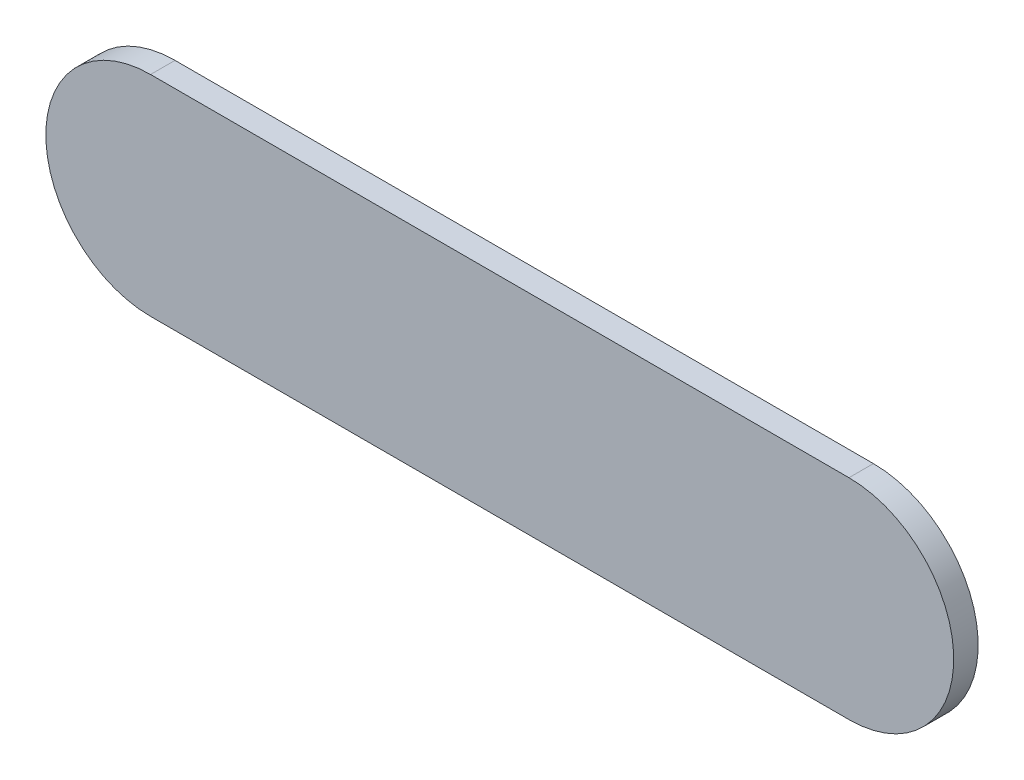
ISO-10303-21;
HEADER;
FILE_DESCRIPTION(('STEP AP214'),'2;1');
FILE_NAME('part.step','',(''),(''),'','','');
FILE_SCHEMA(('AUTOMOTIVE_DESIGN { 1 0 10303 214 1 1 1 1 }'));
ENDSEC;
DATA;
#1=APPLICATION_CONTEXT('core data for automotive mechanical design processes');
#2=APPLICATION_PROTOCOL_DEFINITION('international standard','automotive_design',2000,#1);
#3=PRODUCT_CONTEXT('',#1,'mechanical');
#4=PRODUCT('Part','Part','',(#3));
#5=PRODUCT_RELATED_PRODUCT_CATEGORY('part','',(#4));
#6=PRODUCT_DEFINITION_FORMATION('','',#4);
#7=PRODUCT_DEFINITION_CONTEXT('part definition',#1,'design');
#8=PRODUCT_DEFINITION('design','',#6,#7);
#9=PRODUCT_DEFINITION_SHAPE('','',#8);
#10=(LENGTH_UNIT() NAMED_UNIT(*) SI_UNIT(.MILLI.,.METRE.));
#11=(NAMED_UNIT(*) PLANE_ANGLE_UNIT() SI_UNIT($,.RADIAN.));
#12=(NAMED_UNIT(*) SI_UNIT($,.STERADIAN.) SOLID_ANGLE_UNIT());
#13=UNCERTAINTY_MEASURE_WITH_UNIT(LENGTH_MEASURE(1.E-05),#10,'distance_accuracy_value','');
#14=(GEOMETRIC_REPRESENTATION_CONTEXT(3) GLOBAL_UNCERTAINTY_ASSIGNED_CONTEXT((#13)) GLOBAL_UNIT_ASSIGNED_CONTEXT((#10,
#11,#12)) REPRESENTATION_CONTEXT('',''));
#15=CARTESIAN_POINT('',(0.,0.,0.));
#16=DIRECTION('',(0.,0.,1.));
#17=DIRECTION('',(1.,0.,0.));
#18=AXIS2_PLACEMENT_3D('',#15,#16,#17);
#19=CARTESIAN_POINT('',(95.165,-123.18,1.635));
#20=DIRECTION('',(0.,0.,1.));
#21=DIRECTION('',(1.,0.,0.));
#22=AXIS2_PLACEMENT_3D('',#19,#20,#21);
#23=PLANE('',#22);
#24=DIRECTION('',(-1.,0.,0.));
#25=VECTOR('',#24,1.);
#26=CARTESIAN_POINT('',(95.165,-123.18,1.635));
#27=LINE('',#26,#25);
#28=CARTESIAN_POINT('',(95.165,-123.18,1.635));
#29=VERTEX_POINT('',#28);
#30=CARTESIAN_POINT('',(94.165,-123.18,1.635));
#31=VERTEX_POINT('',#30);
#32=EDGE_CURVE('E83',#29,#31,#27,.T.);
#33=ORIENTED_EDGE('',*,*,#32,.T.);
#34=CARTESIAN_POINT('',(94.165,-123.33,1.635));
#35=DIRECTION('',(0.,0.,1.));
#36=DIRECTION('',(0.,1.,0.));
#37=AXIS2_PLACEMENT_3D('',#34,#35,#36);
#38=CIRCLE('',#37,0.15);
#39=CARTESIAN_POINT('',(94.165,-123.48,1.635));
#40=VERTEX_POINT('',#39);
#41=EDGE_CURVE('E103',#31,#40,#38,.T.);
#42=ORIENTED_EDGE('',*,*,#41,.T.);
#43=DIRECTION('',(1.,0.,0.));
#44=VECTOR('',#43,1.);
#45=CARTESIAN_POINT('',(94.165,-123.48,1.635));
#46=LINE('',#45,#44);
#47=CARTESIAN_POINT('',(95.165,-123.48,1.635));
#48=VERTEX_POINT('',#47);
#49=EDGE_CURVE('E75',#40,#48,#46,.T.);
#50=ORIENTED_EDGE('',*,*,#49,.T.);
#51=CARTESIAN_POINT('',(95.165,-123.33,1.635));
#52=DIRECTION('',(0.,0.,1.));
#53=DIRECTION('',(0.,-1.,0.));
#54=AXIS2_PLACEMENT_3D('',#51,#52,#53);
#55=CIRCLE('',#54,0.15);
#56=EDGE_CURVE('E11',#48,#29,#55,.T.);
#57=ORIENTED_EDGE('',*,*,#56,.T.);
#58=EDGE_LOOP('',(#33,#42,#50,#57));
#59=FACE_BOUND('',#58,.T.);
#60=ADVANCED_FACE('F17',(#59),#23,.T.);
#61=CARTESIAN_POINT('',(95.165,-123.18,1.6));
#62=DIRECTION('',(0.,0.,1.));
#63=DIRECTION('',(1.,0.,0.));
#64=AXIS2_PLACEMENT_3D('',#61,#62,#63);
#65=PLANE('',#64);
#66=CARTESIAN_POINT('',(95.165,-123.33,1.6));
#67=DIRECTION('',(0.,0.,1.));
#68=DIRECTION('',(0.,-1.,0.));
#69=AXIS2_PLACEMENT_3D('',#66,#67,#68);
#70=CIRCLE('',#69,0.15);
#71=CARTESIAN_POINT('',(95.165,-123.48,1.6));
#72=VERTEX_POINT('',#71);
#73=CARTESIAN_POINT('',(95.165,-123.18,1.6));
#74=VERTEX_POINT('',#73);
#75=EDGE_CURVE('E26',#72,#74,#70,.T.);
#76=ORIENTED_EDGE('',*,*,#75,.F.);
#77=DIRECTION('',(1.,0.,0.));
#78=VECTOR('',#77,1.);
#79=CARTESIAN_POINT('',(94.165,-123.48,1.6));
#80=LINE('',#79,#78);
#81=CARTESIAN_POINT('',(94.165,-123.48,1.6));
#82=VERTEX_POINT('',#81);
#83=EDGE_CURVE('E110',#82,#72,#80,.T.);
#84=ORIENTED_EDGE('',*,*,#83,.F.);
#85=CARTESIAN_POINT('',(94.165,-123.33,1.6));
#86=DIRECTION('',(0.,0.,1.));
#87=DIRECTION('',(0.,1.,0.));
#88=AXIS2_PLACEMENT_3D('',#85,#86,#87);
#89=CIRCLE('',#88,0.15);
#90=CARTESIAN_POINT('',(94.165,-123.18,1.6));
#91=VERTEX_POINT('',#90);
#92=EDGE_CURVE('E85',#91,#82,#89,.T.);
#93=ORIENTED_EDGE('',*,*,#92,.F.);
#94=DIRECTION('',(-1.,0.,0.));
#95=VECTOR('',#94,1.);
#96=CARTESIAN_POINT('',(95.165,-123.18,1.6));
#97=LINE('',#96,#95);
#98=EDGE_CURVE('E81',#74,#91,#97,.T.);
#99=ORIENTED_EDGE('',*,*,#98,.F.);
#100=EDGE_LOOP('',(#76,#84,#93,#99));
#101=FACE_BOUND('',#100,.T.);
#102=ADVANCED_FACE('F87',(#101),#65,.F.);
#103=CARTESIAN_POINT('',(95.165,-123.33,1.6));
#104=DIRECTION('',(0.,0.,-1.));
#105=DIRECTION('',(0.,-1.,0.));
#106=AXIS2_PLACEMENT_3D('',#103,#104,#105);
#107=CYLINDRICAL_SURFACE('',#106,0.15);
#108=ORIENTED_EDGE('',*,*,#75,.T.);
#109=DIRECTION('',(0.,0.,1.));
#110=VECTOR('',#109,1.);
#111=CARTESIAN_POINT('',(95.165,-123.18,1.6));
#112=LINE('',#111,#110);
#113=EDGE_CURVE('E70',#74,#29,#112,.T.);
#114=ORIENTED_EDGE('',*,*,#113,.T.);
#115=ORIENTED_EDGE('',*,*,#56,.F.);
#116=DIRECTION('',(0.,0.,1.));
#117=VECTOR('',#116,1.);
#118=CARTESIAN_POINT('',(95.165,-123.48,1.6));
#119=LINE('',#118,#117);
#120=EDGE_CURVE('E20',#72,#48,#119,.T.);
#121=ORIENTED_EDGE('',*,*,#120,.F.);
#122=EDGE_LOOP('',(#108,#114,#115,#121));
#123=FACE_BOUND('',#122,.T.);
#124=ADVANCED_FACE('F69',(#123),#107,.T.);
#125=CARTESIAN_POINT('',(94.165,-123.48,1.6));
#126=DIRECTION('',(0.,1.,0.));
#127=DIRECTION('',(1.,0.,0.));
#128=AXIS2_PLACEMENT_3D('',#125,#126,#127);
#129=PLANE('',#128);
#130=ORIENTED_EDGE('',*,*,#83,.T.);
#131=ORIENTED_EDGE('',*,*,#120,.T.);
#132=ORIENTED_EDGE('',*,*,#49,.F.);
#133=DIRECTION('',(0.,0.,1.));
#134=VECTOR('',#133,1.);
#135=CARTESIAN_POINT('',(94.165,-123.48,1.6));
#136=LINE('',#135,#134);
#137=EDGE_CURVE('E99',#82,#40,#136,.T.);
#138=ORIENTED_EDGE('',*,*,#137,.F.);
#139=EDGE_LOOP('',(#130,#131,#132,#138));
#140=FACE_BOUND('',#139,.T.);
#141=ADVANCED_FACE('F121',(#140),#129,.F.);
#142=CARTESIAN_POINT('',(94.165,-123.33,1.6));
#143=DIRECTION('',(0.,0.,-1.));
#144=DIRECTION('',(0.,1.,0.));
#145=AXIS2_PLACEMENT_3D('',#142,#143,#144);
#146=CYLINDRICAL_SURFACE('',#145,0.15);
#147=ORIENTED_EDGE('',*,*,#92,.T.);
#148=ORIENTED_EDGE('',*,*,#137,.T.);
#149=ORIENTED_EDGE('',*,*,#41,.F.);
#150=DIRECTION('',(0.,0.,1.));
#151=VECTOR('',#150,1.);
#152=CARTESIAN_POINT('',(94.165,-123.18,1.6));
#153=LINE('',#152,#151);
#154=EDGE_CURVE('E91',#91,#31,#153,.T.);
#155=ORIENTED_EDGE('',*,*,#154,.F.);
#156=EDGE_LOOP('',(#147,#148,#149,#155));
#157=FACE_BOUND('',#156,.T.);
#158=ADVANCED_FACE('F124',(#157),#146,.T.);
#159=CARTESIAN_POINT('',(95.165,-123.18,1.6));
#160=DIRECTION('',(0.,-1.,0.));
#161=DIRECTION('',(0.,0.,-1.));
#162=AXIS2_PLACEMENT_3D('',#159,#160,#161);
#163=PLANE('',#162);
#164=ORIENTED_EDGE('',*,*,#98,.T.);
#165=ORIENTED_EDGE('',*,*,#154,.T.);
#166=ORIENTED_EDGE('',*,*,#32,.F.);
#167=ORIENTED_EDGE('',*,*,#113,.F.);
#168=EDGE_LOOP('',(#164,#165,#166,#167));
#169=FACE_BOUND('',#168,.T.);
#170=ADVANCED_FACE('F79',(#169),#163,.F.);
#171=CLOSED_SHELL('',(#60,#102,#124,#141,#158,#170));
#172=MANIFOLD_SOLID_BREP('B1',#171);
#173=ADVANCED_BREP_SHAPE_REPRESENTATION('',(#18,#172),#14);
#174=SHAPE_DEFINITION_REPRESENTATION(#9,#173);
ENDSEC;
END-ISO-10303-21;
